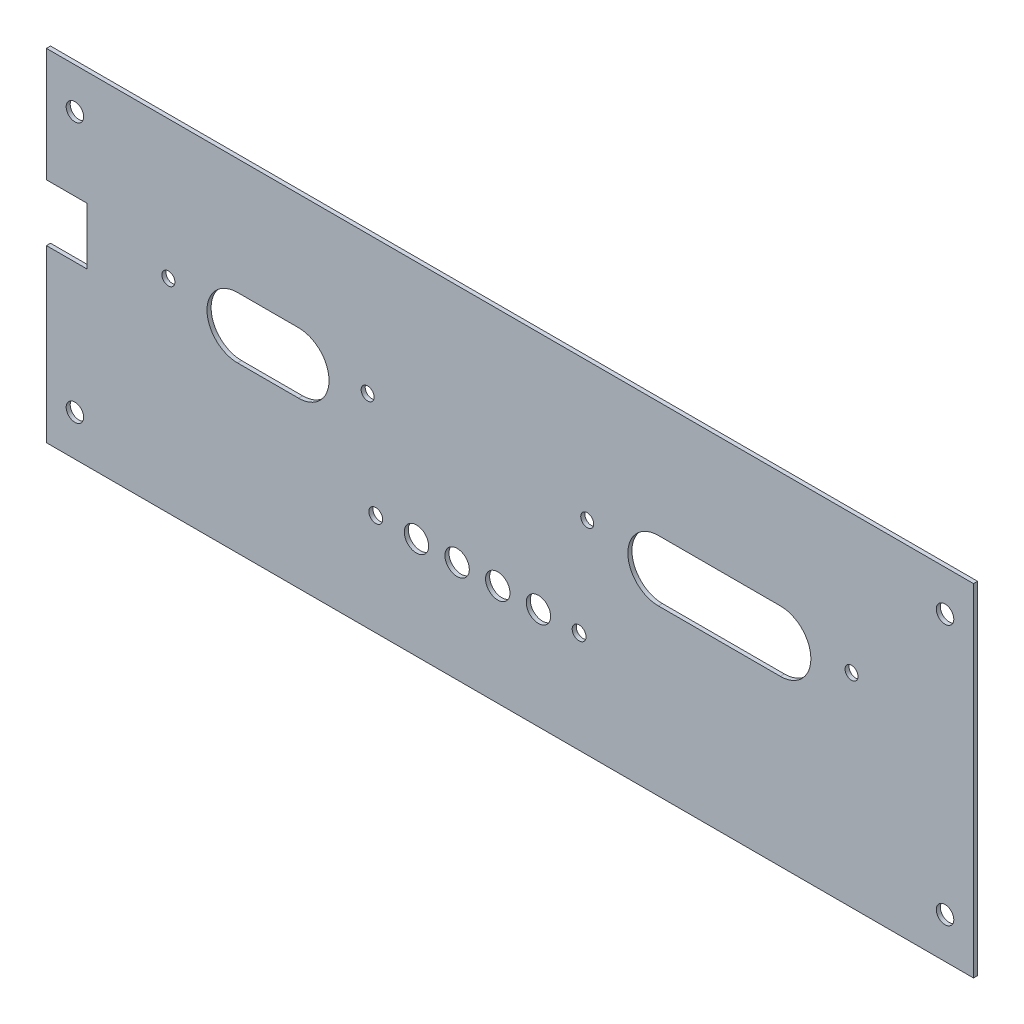
ISO-10303-21;
HEADER;
FILE_DESCRIPTION(('STEP AP214'),'2;1');
FILE_NAME('part.step','',(''),(''),'','','');
FILE_SCHEMA(('AUTOMOTIVE_DESIGN { 1 0 10303 214 1 1 1 1 }'));
ENDSEC;
DATA;
#1=APPLICATION_CONTEXT('core data for automotive mechanical design processes');
#2=APPLICATION_PROTOCOL_DEFINITION('international standard','automotive_design',2000,#1);
#3=PRODUCT_CONTEXT('',#1,'mechanical');
#4=PRODUCT('Part','Part','',(#3));
#5=PRODUCT_RELATED_PRODUCT_CATEGORY('part','',(#4));
#6=PRODUCT_DEFINITION_FORMATION('','',#4);
#7=PRODUCT_DEFINITION_CONTEXT('part definition',#1,'design');
#8=PRODUCT_DEFINITION('design','',#6,#7);
#9=PRODUCT_DEFINITION_SHAPE('','',#8);
#10=(LENGTH_UNIT() NAMED_UNIT(*) SI_UNIT(.MILLI.,.METRE.));
#11=(NAMED_UNIT(*) PLANE_ANGLE_UNIT() SI_UNIT($,.RADIAN.));
#12=(NAMED_UNIT(*) SI_UNIT($,.STERADIAN.) SOLID_ANGLE_UNIT());
#13=UNCERTAINTY_MEASURE_WITH_UNIT(LENGTH_MEASURE(1.E-05),#10,'distance_accuracy_value','');
#14=(GEOMETRIC_REPRESENTATION_CONTEXT(3) GLOBAL_UNCERTAINTY_ASSIGNED_CONTEXT((#13)) GLOBAL_UNIT_ASSIGNED_CONTEXT((#10,
#11,#12)) REPRESENTATION_CONTEXT('',''));
#15=CARTESIAN_POINT('',(0.,0.,0.));
#16=DIRECTION('',(0.,0.,1.));
#17=DIRECTION('',(1.,0.,0.));
#18=AXIS2_PLACEMENT_3D('',#15,#16,#17);
#19=CARTESIAN_POINT('',(-114.,-42.,1.));
#20=DIRECTION('',(1.,0.,0.));
#21=DIRECTION('',(0.,0.,-1.));
#22=AXIS2_PLACEMENT_3D('',#19,#20,#21);
#23=PLANE('',#22);
#24=DIRECTION('',(0.,-1.,0.));
#25=VECTOR('',#24,1.);
#26=CARTESIAN_POINT('',(-114.,-42.,0.));
#27=LINE('',#26,#25);
#28=CARTESIAN_POINT('',(-114.,42.,0.));
#29=VERTEX_POINT('',#28);
#30=CARTESIAN_POINT('',(-114.,14.,0.));
#31=VERTEX_POINT('',#30);
#32=EDGE_CURVE('E293',#29,#31,#27,.T.);
#33=ORIENTED_EDGE('',*,*,#32,.T.);
#34=DIRECTION('',(0.,0.,1.));
#35=VECTOR('',#34,1.);
#36=CARTESIAN_POINT('',(-114.,14.,1.));
#37=LINE('',#36,#35);
#38=CARTESIAN_POINT('',(-114.,14.,1.));
#39=VERTEX_POINT('',#38);
#40=EDGE_CURVE('E11',#31,#39,#37,.T.);
#41=ORIENTED_EDGE('',*,*,#40,.T.);
#42=DIRECTION('',(0.,-1.,0.));
#43=VECTOR('',#42,1.);
#44=CARTESIAN_POINT('',(-114.,-42.,1.));
#45=LINE('',#44,#43);
#46=CARTESIAN_POINT('',(-114.,42.,1.));
#47=VERTEX_POINT('',#46);
#48=EDGE_CURVE('E282',#47,#39,#45,.T.);
#49=ORIENTED_EDGE('',*,*,#48,.F.);
#50=DIRECTION('',(0.,0.,-1.));
#51=VECTOR('',#50,1.);
#52=CARTESIAN_POINT('',(-114.,42.,1.));
#53=LINE('',#52,#51);
#54=EDGE_CURVE('E292',#47,#29,#53,.T.);
#55=ORIENTED_EDGE('',*,*,#54,.T.);
#56=EDGE_LOOP('',(#33,#41,#49,#55));
#57=FACE_BOUND('',#56,.T.);
#58=ADVANCED_FACE('F31',(#57),#23,.F.);
#59=CARTESIAN_POINT('',(-114.,-42.,1.));
#60=DIRECTION('',(0.,0.,-1.));
#61=DIRECTION('',(-1.,0.,0.));
#62=AXIS2_PLACEMENT_3D('',#59,#60,#61);
#63=PLANE('',#62);
#64=CARTESIAN_POINT('',(-23.,-17.,1.));
#65=DIRECTION('',(0.,0.,1.));
#66=DIRECTION('',(1.,0.,0.));
#67=AXIS2_PLACEMENT_3D('',#64,#65,#66);
#68=CIRCLE('',#67,3.);
#69=CARTESIAN_POINT('',(-20.,-17.,1.));
#70=VERTEX_POINT('',#69);
#71=EDGE_CURVE('E342',#70,#70,#68,.T.);
#72=ORIENTED_EDGE('',*,*,#71,.F.);
#73=EDGE_LOOP('',(#72));
#74=FACE_BOUND('',#73,.T.);
#75=CARTESIAN_POINT('',(-13.,-17.,1.));
#76=DIRECTION('',(0.,0.,1.));
#77=DIRECTION('',(1.,0.,0.));
#78=AXIS2_PLACEMENT_3D('',#75,#76,#77);
#79=CIRCLE('',#78,3.);
#80=CARTESIAN_POINT('',(-10.,-17.,1.));
#81=VERTEX_POINT('',#80);
#82=EDGE_CURVE('E332',#81,#81,#79,.T.);
#83=ORIENTED_EDGE('',*,*,#82,.F.);
#84=EDGE_LOOP('',(#83));
#85=FACE_BOUND('',#84,.T.);
#86=CARTESIAN_POINT('',(-3.00000000000001,-17.,1.));
#87=DIRECTION('',(0.,0.,1.));
#88=DIRECTION('',(1.,0.,0.));
#89=AXIS2_PLACEMENT_3D('',#86,#87,#88);
#90=CIRCLE('',#89,3.);
#91=CARTESIAN_POINT('',(0.,-17.,1.));
#92=VERTEX_POINT('',#91);
#93=EDGE_CURVE('E329',#92,#92,#90,.T.);
#94=ORIENTED_EDGE('',*,*,#93,.F.);
#95=EDGE_LOOP('',(#94));
#96=FACE_BOUND('',#95,.T.);
#97=CARTESIAN_POINT('',(6.99999999999999,-17.,1.));
#98=DIRECTION('',(0.,0.,1.));
#99=DIRECTION('',(1.,0.,0.));
#100=AXIS2_PLACEMENT_3D('',#97,#98,#99);
#101=CIRCLE('',#100,3.);
#102=CARTESIAN_POINT('',(9.99999999999999,-17.,1.));
#103=VERTEX_POINT('',#102);
#104=EDGE_CURVE('E326',#103,#103,#101,.T.);
#105=ORIENTED_EDGE('',*,*,#104,.F.);
#106=EDGE_LOOP('',(#105));
#107=FACE_BOUND('',#106,.T.);
#108=CARTESIAN_POINT('',(17.,-17.,1.));
#109=DIRECTION('',(0.,0.,1.));
#110=DIRECTION('',(1.,0.,0.));
#111=AXIS2_PLACEMENT_3D('',#108,#109,#110);
#112=CIRCLE('',#111,1.7);
#113=CARTESIAN_POINT('',(18.7,-17.,1.));
#114=VERTEX_POINT('',#113);
#115=EDGE_CURVE('E322',#114,#114,#112,.T.);
#116=ORIENTED_EDGE('',*,*,#115,.F.);
#117=EDGE_LOOP('',(#116));
#118=FACE_BOUND('',#117,.T.);
#119=CARTESIAN_POINT('',(-33.,-17.,1.));
#120=DIRECTION('',(0.,0.,1.));
#121=DIRECTION('',(1.,0.,0.));
#122=AXIS2_PLACEMENT_3D('',#119,#120,#121);
#123=CIRCLE('',#122,1.7);
#124=CARTESIAN_POINT('',(-31.3,-17.,1.));
#125=VERTEX_POINT('',#124);
#126=EDGE_CURVE('E318',#125,#125,#123,.T.);
#127=ORIENTED_EDGE('',*,*,#126,.F.);
#128=EDGE_LOOP('',(#127));
#129=FACE_BOUND('',#128,.T.);
#130=CARTESIAN_POINT('',(-35.,8.00000000000001,1.));
#131=DIRECTION('',(0.,0.,1.));
#132=DIRECTION('',(1.,0.,0.));
#133=AXIS2_PLACEMENT_3D('',#130,#131,#132);
#134=CIRCLE('',#133,1.6);
#135=CARTESIAN_POINT('',(-33.4,8.00000000000001,1.));
#136=VERTEX_POINT('',#135);
#137=EDGE_CURVE('E170',#136,#136,#134,.T.);
#138=ORIENTED_EDGE('',*,*,#137,.F.);
#139=EDGE_LOOP('',(#138));
#140=FACE_BOUND('',#139,.T.);
#141=DIRECTION('',(1.,0.,0.));
#142=VECTOR('',#141,1.);
#143=CARTESIAN_POINT('',(-67.,-1.5,1.));
#144=LINE('',#143,#142);
#145=CARTESIAN_POINT('',(-67.,-1.5,1.));
#146=VERTEX_POINT('',#145);
#147=CARTESIAN_POINT('',(-52.,-1.5,1.));
#148=VERTEX_POINT('',#147);
#149=EDGE_CURVE('E176',#146,#148,#144,.T.);
#150=ORIENTED_EDGE('',*,*,#149,.F.);
#151=CARTESIAN_POINT('',(-67.,6.,1.));
#152=DIRECTION('',(0.,0.,1.));
#153=DIRECTION('',(1.,0.,0.));
#154=AXIS2_PLACEMENT_3D('',#151,#152,#153);
#155=CIRCLE('',#154,7.5);
#156=CARTESIAN_POINT('',(-67.,13.5,1.));
#157=VERTEX_POINT('',#156);
#158=EDGE_CURVE('E48',#157,#146,#155,.T.);
#159=ORIENTED_EDGE('',*,*,#158,.F.);
#160=DIRECTION('',(-1.,0.,0.));
#161=VECTOR('',#160,1.);
#162=CARTESIAN_POINT('',(-67.,13.5,1.));
#163=LINE('',#162,#161);
#164=CARTESIAN_POINT('',(-52.,13.5,1.));
#165=VERTEX_POINT('',#164);
#166=EDGE_CURVE('E164',#165,#157,#163,.T.);
#167=ORIENTED_EDGE('',*,*,#166,.F.);
#168=CARTESIAN_POINT('',(-52.,6.,1.));
#169=DIRECTION('',(0.,0.,1.));
#170=DIRECTION('',(-1.,0.,0.));
#171=AXIS2_PLACEMENT_3D('',#168,#169,#170);
#172=CIRCLE('',#171,7.5);
#173=EDGE_CURVE('E167',#148,#165,#172,.T.);
#174=ORIENTED_EDGE('',*,*,#173,.F.);
#175=EDGE_LOOP('',(#150,#159,#167,#174));
#176=FACE_BOUND('',#175,.T.);
#177=CARTESIAN_POINT('',(-84.,8.00000000000001,1.));
#178=DIRECTION('',(0.,0.,1.));
#179=DIRECTION('',(1.,0.,0.));
#180=AXIS2_PLACEMENT_3D('',#177,#178,#179);
#181=CIRCLE('',#180,1.6);
#182=CARTESIAN_POINT('',(-82.4,8.00000000000001,1.));
#183=VERTEX_POINT('',#182);
#184=EDGE_CURVE('E183',#183,#183,#181,.T.);
#185=ORIENTED_EDGE('',*,*,#184,.F.);
#186=EDGE_LOOP('',(#185));
#187=FACE_BOUND('',#186,.T.);
#188=CARTESIAN_POINT('',(84.,8.00000000000001,1.));
#189=DIRECTION('',(0.,0.,1.));
#190=DIRECTION('',(1.,0.,0.));
#191=AXIS2_PLACEMENT_3D('',#188,#189,#190);
#192=CIRCLE('',#191,1.6);
#193=CARTESIAN_POINT('',(85.6,8.00000000000001,1.));
#194=VERTEX_POINT('',#193);
#195=EDGE_CURVE('E190',#194,#194,#192,.T.);
#196=ORIENTED_EDGE('',*,*,#195,.F.);
#197=EDGE_LOOP('',(#196));
#198=FACE_BOUND('',#197,.T.);
#199=DIRECTION('',(1.,0.,0.));
#200=VECTOR('',#199,1.);
#201=CARTESIAN_POINT('',(36.5,-1.5,1.));
#202=LINE('',#201,#200);
#203=CARTESIAN_POINT('',(36.5,-1.5,1.));
#204=VERTEX_POINT('',#203);
#205=CARTESIAN_POINT('',(66.5,-1.5,1.));
#206=VERTEX_POINT('',#205);
#207=EDGE_CURVE('E214',#204,#206,#202,.T.);
#208=ORIENTED_EDGE('',*,*,#207,.F.);
#209=CARTESIAN_POINT('',(36.5,6.,1.));
#210=DIRECTION('',(0.,0.,1.));
#211=DIRECTION('',(1.,0.,0.));
#212=AXIS2_PLACEMENT_3D('',#209,#210,#211);
#213=CIRCLE('',#212,7.5);
#214=CARTESIAN_POINT('',(36.5,13.5,1.));
#215=VERTEX_POINT('',#214);
#216=EDGE_CURVE('E196',#215,#204,#213,.T.);
#217=ORIENTED_EDGE('',*,*,#216,.F.);
#218=DIRECTION('',(-1.,0.,0.));
#219=VECTOR('',#218,1.);
#220=CARTESIAN_POINT('',(36.5,13.5,1.));
#221=LINE('',#220,#219);
#222=CARTESIAN_POINT('',(66.5,13.5,1.));
#223=VERTEX_POINT('',#222);
#224=EDGE_CURVE('E203',#223,#215,#221,.T.);
#225=ORIENTED_EDGE('',*,*,#224,.F.);
#226=CARTESIAN_POINT('',(66.5,6.,1.));
#227=DIRECTION('',(0.,0.,1.));
#228=DIRECTION('',(-1.,0.,0.));
#229=AXIS2_PLACEMENT_3D('',#226,#227,#228);
#230=CIRCLE('',#229,7.5);
#231=EDGE_CURVE('E217',#206,#223,#230,.T.);
#232=ORIENTED_EDGE('',*,*,#231,.F.);
#233=EDGE_LOOP('',(#208,#217,#225,#232));
#234=FACE_BOUND('',#233,.T.);
#235=CARTESIAN_POINT('',(19.,8.00000000000001,1.));
#236=DIRECTION('',(0.,0.,1.));
#237=DIRECTION('',(1.,0.,0.));
#238=AXIS2_PLACEMENT_3D('',#235,#236,#237);
#239=CIRCLE('',#238,1.6);
#240=CARTESIAN_POINT('',(20.6,8.00000000000001,1.));
#241=VERTEX_POINT('',#240);
#242=EDGE_CURVE('E224',#241,#241,#239,.T.);
#243=ORIENTED_EDGE('',*,*,#242,.F.);
#244=EDGE_LOOP('',(#243));
#245=FACE_BOUND('',#244,.T.);
#246=CARTESIAN_POINT('',(-107.,-32.,1.));
#247=DIRECTION('',(0.,0.,1.));
#248=DIRECTION('',(1.,0.,0.));
#249=AXIS2_PLACEMENT_3D('',#246,#247,#248);
#250=CIRCLE('',#249,2.15);
#251=CARTESIAN_POINT('',(-104.85,-32.,1.));
#252=VERTEX_POINT('',#251);
#253=EDGE_CURVE('E264',#252,#252,#250,.T.);
#254=ORIENTED_EDGE('',*,*,#253,.F.);
#255=EDGE_LOOP('',(#254));
#256=FACE_BOUND('',#255,.T.);
#257=CARTESIAN_POINT('',(107.,32.,1.));
#258=DIRECTION('',(0.,0.,1.));
#259=DIRECTION('',(1.,0.,0.));
#260=AXIS2_PLACEMENT_3D('',#257,#258,#259);
#261=CIRCLE('',#260,2.15);
#262=CARTESIAN_POINT('',(109.15,32.,1.));
#263=VERTEX_POINT('',#262);
#264=EDGE_CURVE('E276',#263,#263,#261,.T.);
#265=ORIENTED_EDGE('',*,*,#264,.F.);
#266=EDGE_LOOP('',(#265));
#267=FACE_BOUND('',#266,.T.);
#268=ORIENTED_EDGE('',*,*,#48,.T.);
#269=DIRECTION('',(-1.,0.,0.));
#270=VECTOR('',#269,1.);
#271=CARTESIAN_POINT('',(-118.464145401672,14.,1.));
#272=LINE('',#271,#270);
#273=CARTESIAN_POINT('',(-104.,14.,1.));
#274=VERTEX_POINT('',#273);
#275=EDGE_CURVE('E241',#274,#39,#272,.T.);
#276=ORIENTED_EDGE('',*,*,#275,.F.);
#277=DIRECTION('',(0.,1.,0.));
#278=VECTOR('',#277,1.);
#279=CARTESIAN_POINT('',(-104.,0.,1.));
#280=LINE('',#279,#278);
#281=CARTESIAN_POINT('',(-104.,0.,1.));
#282=VERTEX_POINT('',#281);
#283=EDGE_CURVE('E249',#282,#274,#280,.T.);
#284=ORIENTED_EDGE('',*,*,#283,.F.);
#285=DIRECTION('',(1.,0.,0.));
#286=VECTOR('',#285,1.);
#287=CARTESIAN_POINT('',(-118.464145401672,0.,1.));
#288=LINE('',#287,#286);
#289=CARTESIAN_POINT('',(-114.,0.,1.));
#290=VERTEX_POINT('',#289);
#291=EDGE_CURVE('E234',#290,#282,#288,.T.);
#292=ORIENTED_EDGE('',*,*,#291,.F.);
#293=CARTESIAN_POINT('',(-114.,-42.,1.));
#294=VERTEX_POINT('',#293);
#295=EDGE_CURVE('E286',#290,#294,#45,.T.);
#296=ORIENTED_EDGE('',*,*,#295,.T.);
#297=DIRECTION('',(1.,0.,0.));
#298=VECTOR('',#297,1.);
#299=CARTESIAN_POINT('',(-114.,-42.,1.));
#300=LINE('',#299,#298);
#301=CARTESIAN_POINT('',(114.,-42.,1.));
#302=VERTEX_POINT('',#301);
#303=EDGE_CURVE('E285',#294,#302,#300,.T.);
#304=ORIENTED_EDGE('',*,*,#303,.T.);
#305=DIRECTION('',(0.,1.,0.));
#306=VECTOR('',#305,1.);
#307=CARTESIAN_POINT('',(114.,-42.,1.));
#308=LINE('',#307,#306);
#309=CARTESIAN_POINT('',(114.,42.,1.));
#310=VERTEX_POINT('',#309);
#311=EDGE_CURVE('E288',#302,#310,#308,.T.);
#312=ORIENTED_EDGE('',*,*,#311,.T.);
#313=DIRECTION('',(-1.,0.,0.));
#314=VECTOR('',#313,1.);
#315=CARTESIAN_POINT('',(-114.,42.,1.));
#316=LINE('',#315,#314);
#317=EDGE_CURVE('E290',#310,#47,#316,.T.);
#318=ORIENTED_EDGE('',*,*,#317,.T.);
#319=EDGE_LOOP('',(#268,#276,#284,#292,#296,#304,#312,#318));
#320=FACE_BOUND('',#319,.T.);
#321=CARTESIAN_POINT('',(-107.,32.,1.));
#322=DIRECTION('',(0.,0.,1.));
#323=DIRECTION('',(-1.,0.,0.));
#324=AXIS2_PLACEMENT_3D('',#321,#322,#323);
#325=CIRCLE('',#324,2.15);
#326=CARTESIAN_POINT('',(-109.15,32.,1.));
#327=VERTEX_POINT('',#326);
#328=EDGE_CURVE('E270',#327,#327,#325,.T.);
#329=ORIENTED_EDGE('',*,*,#328,.F.);
#330=EDGE_LOOP('',(#329));
#331=FACE_BOUND('',#330,.T.);
#332=CARTESIAN_POINT('',(107.,-32.,1.));
#333=DIRECTION('',(0.,0.,1.));
#334=DIRECTION('',(-1.,0.,0.));
#335=AXIS2_PLACEMENT_3D('',#332,#333,#334);
#336=CIRCLE('',#335,2.15);
#337=CARTESIAN_POINT('',(104.85,-32.,1.));
#338=VERTEX_POINT('',#337);
#339=EDGE_CURVE('E258',#338,#338,#336,.T.);
#340=ORIENTED_EDGE('',*,*,#339,.F.);
#341=EDGE_LOOP('',(#340));
#342=FACE_BOUND('',#341,.T.);
#343=ADVANCED_FACE('F358',(#74,#85,#96,#107,#118,#129,#140,#176,#187,#198,#234,#245,#256,#267,
#320,#331,#342),#63,.F.);
#344=CARTESIAN_POINT('',(-114.,-42.,0.));
#345=DIRECTION('',(0.,0.,-1.));
#346=DIRECTION('',(-1.,0.,0.));
#347=AXIS2_PLACEMENT_3D('',#344,#345,#346);
#348=PLANE('',#347);
#349=CARTESIAN_POINT('',(-23.,-17.,0.));
#350=DIRECTION('',(0.,0.,-1.));
#351=DIRECTION('',(-1.,0.,0.));
#352=AXIS2_PLACEMENT_3D('',#349,#350,#351);
#353=CIRCLE('',#352,3.);
#354=CARTESIAN_POINT('',(-26.,-17.,0.));
#355=VERTEX_POINT('',#354);
#356=EDGE_CURVE('E35',#355,#355,#353,.T.);
#357=ORIENTED_EDGE('',*,*,#356,.F.);
#358=EDGE_LOOP('',(#357));
#359=FACE_BOUND('',#358,.T.);
#360=CARTESIAN_POINT('',(-13.,-17.,0.));
#361=DIRECTION('',(0.,0.,-1.));
#362=DIRECTION('',(-1.,0.,0.));
#363=AXIS2_PLACEMENT_3D('',#360,#361,#362);
#364=CIRCLE('',#363,3.);
#365=CARTESIAN_POINT('',(-16.,-17.,0.));
#366=VERTEX_POINT('',#365);
#367=EDGE_CURVE('E330',#366,#366,#364,.T.);
#368=ORIENTED_EDGE('',*,*,#367,.F.);
#369=EDGE_LOOP('',(#368));
#370=FACE_BOUND('',#369,.T.);
#371=CARTESIAN_POINT('',(-3.00000000000001,-17.,0.));
#372=DIRECTION('',(0.,0.,-1.));
#373=DIRECTION('',(-1.,0.,0.));
#374=AXIS2_PLACEMENT_3D('',#371,#372,#373);
#375=CIRCLE('',#374,3.);
#376=CARTESIAN_POINT('',(-6.00000000000001,-17.,0.));
#377=VERTEX_POINT('',#376);
#378=EDGE_CURVE('E327',#377,#377,#375,.T.);
#379=ORIENTED_EDGE('',*,*,#378,.F.);
#380=EDGE_LOOP('',(#379));
#381=FACE_BOUND('',#380,.T.);
#382=CARTESIAN_POINT('',(6.99999999999999,-17.,0.));
#383=DIRECTION('',(0.,0.,-1.));
#384=DIRECTION('',(-1.,0.,0.));
#385=AXIS2_PLACEMENT_3D('',#382,#383,#384);
#386=CIRCLE('',#385,3.);
#387=CARTESIAN_POINT('',(3.99999999999998,-17.,0.));
#388=VERTEX_POINT('',#387);
#389=EDGE_CURVE('E323',#388,#388,#386,.T.);
#390=ORIENTED_EDGE('',*,*,#389,.F.);
#391=EDGE_LOOP('',(#390));
#392=FACE_BOUND('',#391,.T.);
#393=CARTESIAN_POINT('',(17.,-17.,0.));
#394=DIRECTION('',(0.,0.,-1.));
#395=DIRECTION('',(-1.,0.,0.));
#396=AXIS2_PLACEMENT_3D('',#393,#394,#395);
#397=CIRCLE('',#396,1.7);
#398=CARTESIAN_POINT('',(15.3,-17.,0.));
#399=VERTEX_POINT('',#398);
#400=EDGE_CURVE('E319',#399,#399,#397,.T.);
#401=ORIENTED_EDGE('',*,*,#400,.F.);
#402=EDGE_LOOP('',(#401));
#403=FACE_BOUND('',#402,.T.);
#404=CARTESIAN_POINT('',(-33.,-17.,0.));
#405=DIRECTION('',(0.,0.,-1.));
#406=DIRECTION('',(-1.,0.,0.));
#407=AXIS2_PLACEMENT_3D('',#404,#405,#406);
#408=CIRCLE('',#407,1.7);
#409=CARTESIAN_POINT('',(-34.7,-17.,0.));
#410=VERTEX_POINT('',#409);
#411=EDGE_CURVE('E315',#410,#410,#408,.T.);
#412=ORIENTED_EDGE('',*,*,#411,.F.);
#413=EDGE_LOOP('',(#412));
#414=FACE_BOUND('',#413,.T.);
#415=CARTESIAN_POINT('',(-35.,8.00000000000001,0.));
#416=DIRECTION('',(0.,0.,1.));
#417=DIRECTION('',(1.,0.,0.));
#418=AXIS2_PLACEMENT_3D('',#415,#416,#417);
#419=CIRCLE('',#418,1.6);
#420=CARTESIAN_POINT('',(-33.4,8.00000000000001,0.));
#421=VERTEX_POINT('',#420);
#422=EDGE_CURVE('E177',#421,#421,#419,.T.);
#423=ORIENTED_EDGE('',*,*,#422,.T.);
#424=EDGE_LOOP('',(#423));
#425=FACE_BOUND('',#424,.T.);
#426=CARTESIAN_POINT('',(-67.,6.,0.));
#427=DIRECTION('',(0.,0.,1.));
#428=DIRECTION('',(1.,0.,0.));
#429=AXIS2_PLACEMENT_3D('',#426,#427,#428);
#430=CIRCLE('',#429,7.5);
#431=CARTESIAN_POINT('',(-67.,13.5,0.));
#432=VERTEX_POINT('',#431);
#433=CARTESIAN_POINT('',(-67.,-1.5,0.));
#434=VERTEX_POINT('',#433);
#435=EDGE_CURVE('E148',#432,#434,#430,.T.);
#436=ORIENTED_EDGE('',*,*,#435,.T.);
#437=DIRECTION('',(1.,0.,0.));
#438=VECTOR('',#437,1.);
#439=CARTESIAN_POINT('',(-67.,-1.5,0.));
#440=LINE('',#439,#438);
#441=CARTESIAN_POINT('',(-52.,-1.5,0.));
#442=VERTEX_POINT('',#441);
#443=EDGE_CURVE('E157',#434,#442,#440,.T.);
#444=ORIENTED_EDGE('',*,*,#443,.T.);
#445=CARTESIAN_POINT('',(-52.,6.,0.));
#446=DIRECTION('',(0.,0.,1.));
#447=DIRECTION('',(-1.,0.,0.));
#448=AXIS2_PLACEMENT_3D('',#445,#446,#447);
#449=CIRCLE('',#448,7.5);
#450=CARTESIAN_POINT('',(-52.,13.5,0.));
#451=VERTEX_POINT('',#450);
#452=EDGE_CURVE('E56',#442,#451,#449,.T.);
#453=ORIENTED_EDGE('',*,*,#452,.T.);
#454=DIRECTION('',(-1.,0.,0.));
#455=VECTOR('',#454,1.);
#456=CARTESIAN_POINT('',(-67.,13.5,0.));
#457=LINE('',#456,#455);
#458=EDGE_CURVE('E154',#451,#432,#457,.T.);
#459=ORIENTED_EDGE('',*,*,#458,.T.);
#460=EDGE_LOOP('',(#436,#444,#453,#459));
#461=FACE_BOUND('',#460,.T.);
#462=CARTESIAN_POINT('',(-84.,8.00000000000001,0.));
#463=DIRECTION('',(0.,0.,1.));
#464=DIRECTION('',(1.,0.,0.));
#465=AXIS2_PLACEMENT_3D('',#462,#463,#464);
#466=CIRCLE('',#465,1.6);
#467=CARTESIAN_POINT('',(-82.4,8.00000000000001,0.));
#468=VERTEX_POINT('',#467);
#469=EDGE_CURVE('E187',#468,#468,#466,.T.);
#470=ORIENTED_EDGE('',*,*,#469,.T.);
#471=EDGE_LOOP('',(#470));
#472=FACE_BOUND('',#471,.T.);
#473=CARTESIAN_POINT('',(84.,8.00000000000001,0.));
#474=DIRECTION('',(0.,0.,1.));
#475=DIRECTION('',(1.,0.,0.));
#476=AXIS2_PLACEMENT_3D('',#473,#474,#475);
#477=CIRCLE('',#476,1.6);
#478=CARTESIAN_POINT('',(85.6,8.00000000000001,0.));
#479=VERTEX_POINT('',#478);
#480=EDGE_CURVE('E193',#479,#479,#477,.T.);
#481=ORIENTED_EDGE('',*,*,#480,.T.);
#482=EDGE_LOOP('',(#481));
#483=FACE_BOUND('',#482,.T.);
#484=CARTESIAN_POINT('',(36.5,6.,0.));
#485=DIRECTION('',(0.,0.,1.));
#486=DIRECTION('',(1.,0.,0.));
#487=AXIS2_PLACEMENT_3D('',#484,#485,#486);
#488=CIRCLE('',#487,7.5);
#489=CARTESIAN_POINT('',(36.5,13.5,0.));
#490=VERTEX_POINT('',#489);
#491=CARTESIAN_POINT('',(36.5,-1.5,0.));
#492=VERTEX_POINT('',#491);
#493=EDGE_CURVE('E199',#490,#492,#488,.T.);
#494=ORIENTED_EDGE('',*,*,#493,.T.);
#495=DIRECTION('',(1.,0.,0.));
#496=VECTOR('',#495,1.);
#497=CARTESIAN_POINT('',(36.5,-1.5,0.));
#498=LINE('',#497,#496);
#499=CARTESIAN_POINT('',(66.5,-1.5,0.));
#500=VERTEX_POINT('',#499);
#501=EDGE_CURVE('E202',#492,#500,#498,.T.);
#502=ORIENTED_EDGE('',*,*,#501,.T.);
#503=CARTESIAN_POINT('',(66.5,6.,0.));
#504=DIRECTION('',(0.,0.,1.));
#505=DIRECTION('',(-1.,0.,0.));
#506=AXIS2_PLACEMENT_3D('',#503,#504,#505);
#507=CIRCLE('',#506,7.5);
#508=CARTESIAN_POINT('',(66.5,13.5,0.));
#509=VERTEX_POINT('',#508);
#510=EDGE_CURVE('E206',#500,#509,#507,.T.);
#511=ORIENTED_EDGE('',*,*,#510,.T.);
#512=DIRECTION('',(-1.,0.,0.));
#513=VECTOR('',#512,1.);
#514=CARTESIAN_POINT('',(36.5,13.5,0.));
#515=LINE('',#514,#513);
#516=EDGE_CURVE('E209',#509,#490,#515,.T.);
#517=ORIENTED_EDGE('',*,*,#516,.T.);
#518=EDGE_LOOP('',(#494,#502,#511,#517));
#519=FACE_BOUND('',#518,.T.);
#520=CARTESIAN_POINT('',(19.,8.00000000000001,0.));
#521=DIRECTION('',(0.,0.,1.));
#522=DIRECTION('',(1.,0.,0.));
#523=AXIS2_PLACEMENT_3D('',#520,#521,#522);
#524=CIRCLE('',#523,1.6);
#525=CARTESIAN_POINT('',(20.6,8.00000000000001,0.));
#526=VERTEX_POINT('',#525);
#527=EDGE_CURVE('E231',#526,#526,#524,.T.);
#528=ORIENTED_EDGE('',*,*,#527,.T.);
#529=EDGE_LOOP('',(#528));
#530=FACE_BOUND('',#529,.T.);
#531=DIRECTION('',(-1.,0.,0.));
#532=VECTOR('',#531,1.);
#533=CARTESIAN_POINT('',(-118.464145401672,14.,0.));
#534=LINE('',#533,#532);
#535=CARTESIAN_POINT('',(-104.,14.,0.));
#536=VERTEX_POINT('',#535);
#537=EDGE_CURVE('E244',#536,#31,#534,.T.);
#538=ORIENTED_EDGE('',*,*,#537,.T.);
#539=ORIENTED_EDGE('',*,*,#32,.F.);
#540=DIRECTION('',(-1.,0.,0.));
#541=VECTOR('',#540,1.);
#542=CARTESIAN_POINT('',(-114.,42.,0.));
#543=LINE('',#542,#541);
#544=CARTESIAN_POINT('',(114.,42.,0.));
#545=VERTEX_POINT('',#544);
#546=EDGE_CURVE('E300',#545,#29,#543,.T.);
#547=ORIENTED_EDGE('',*,*,#546,.F.);
#548=DIRECTION('',(0.,1.,0.));
#549=VECTOR('',#548,1.);
#550=CARTESIAN_POINT('',(114.,-42.,0.));
#551=LINE('',#550,#549);
#552=CARTESIAN_POINT('',(114.,-42.,0.));
#553=VERTEX_POINT('',#552);
#554=EDGE_CURVE('E298',#553,#545,#551,.T.);
#555=ORIENTED_EDGE('',*,*,#554,.F.);
#556=DIRECTION('',(1.,0.,0.));
#557=VECTOR('',#556,1.);
#558=CARTESIAN_POINT('',(-114.,-42.,0.));
#559=LINE('',#558,#557);
#560=CARTESIAN_POINT('',(-114.,-42.,0.));
#561=VERTEX_POINT('',#560);
#562=EDGE_CURVE('E296',#561,#553,#559,.T.);
#563=ORIENTED_EDGE('',*,*,#562,.F.);
#564=CARTESIAN_POINT('',(-114.,0.,0.));
#565=VERTEX_POINT('',#564);
#566=EDGE_CURVE('E279',#565,#561,#27,.T.);
#567=ORIENTED_EDGE('',*,*,#566,.F.);
#568=DIRECTION('',(1.,0.,0.));
#569=VECTOR('',#568,1.);
#570=CARTESIAN_POINT('',(-118.464145401672,0.,0.));
#571=LINE('',#570,#569);
#572=CARTESIAN_POINT('',(-104.,0.,0.));
#573=VERTEX_POINT('',#572);
#574=EDGE_CURVE('E237',#565,#573,#571,.T.);
#575=ORIENTED_EDGE('',*,*,#574,.T.);
#576=DIRECTION('',(0.,1.,0.));
#577=VECTOR('',#576,1.);
#578=CARTESIAN_POINT('',(-104.,0.,0.));
#579=LINE('',#578,#577);
#580=EDGE_CURVE('E240',#573,#536,#579,.T.);
#581=ORIENTED_EDGE('',*,*,#580,.T.);
#582=EDGE_LOOP('',(#538,#539,#547,#555,#563,#567,#575,#581));
#583=FACE_BOUND('',#582,.T.);
#584=CARTESIAN_POINT('',(-107.,-32.,0.));
#585=DIRECTION('',(0.,0.,1.));
#586=DIRECTION('',(1.,0.,0.));
#587=AXIS2_PLACEMENT_3D('',#584,#585,#586);
#588=CIRCLE('',#587,2.15);
#589=CARTESIAN_POINT('',(-104.85,-32.,0.));
#590=VERTEX_POINT('',#589);
#591=EDGE_CURVE('E261',#590,#590,#588,.T.);
#592=ORIENTED_EDGE('',*,*,#591,.T.);
#593=EDGE_LOOP('',(#592));
#594=FACE_BOUND('',#593,.T.);
#595=CARTESIAN_POINT('',(107.,32.,0.));
#596=DIRECTION('',(0.,0.,1.));
#597=DIRECTION('',(1.,0.,0.));
#598=AXIS2_PLACEMENT_3D('',#595,#596,#597);
#599=CIRCLE('',#598,2.15);
#600=CARTESIAN_POINT('',(109.15,32.,0.));
#601=VERTEX_POINT('',#600);
#602=EDGE_CURVE('E273',#601,#601,#599,.T.);
#603=ORIENTED_EDGE('',*,*,#602,.T.);
#604=EDGE_LOOP('',(#603));
#605=FACE_BOUND('',#604,.T.);
#606=CARTESIAN_POINT('',(-107.,32.,0.));
#607=DIRECTION('',(0.,0.,1.));
#608=DIRECTION('',(-1.,0.,0.));
#609=AXIS2_PLACEMENT_3D('',#606,#607,#608);
#610=CIRCLE('',#609,2.15);
#611=CARTESIAN_POINT('',(-109.15,32.,0.));
#612=VERTEX_POINT('',#611);
#613=EDGE_CURVE('E267',#612,#612,#610,.T.);
#614=ORIENTED_EDGE('',*,*,#613,.T.);
#615=EDGE_LOOP('',(#614));
#616=FACE_BOUND('',#615,.T.);
#617=CARTESIAN_POINT('',(107.,-32.,0.));
#618=DIRECTION('',(0.,0.,1.));
#619=DIRECTION('',(-1.,0.,0.));
#620=AXIS2_PLACEMENT_3D('',#617,#618,#619);
#621=CIRCLE('',#620,2.15);
#622=CARTESIAN_POINT('',(104.85,-32.,0.));
#623=VERTEX_POINT('',#622);
#624=EDGE_CURVE('E255',#623,#623,#621,.T.);
#625=ORIENTED_EDGE('',*,*,#624,.T.);
#626=EDGE_LOOP('',(#625));
#627=FACE_BOUND('',#626,.T.);
#628=ADVANCED_FACE('F161',(#359,#370,#381,#392,#403,#414,#425,#461,#472,#483,#519,#530,#583,
#594,#605,#616,#627),#348,.T.);
#629=ORIENTED_EDGE('',*,*,#295,.F.);
#630=DIRECTION('',(0.,0.,-1.));
#631=VECTOR('',#630,1.);
#632=CARTESIAN_POINT('',(-114.,0.,1.));
#633=LINE('',#632,#631);
#634=EDGE_CURVE('E40',#290,#565,#633,.T.);
#635=ORIENTED_EDGE('',*,*,#634,.T.);
#636=ORIENTED_EDGE('',*,*,#566,.T.);
#637=DIRECTION('',(0.,0.,-1.));
#638=VECTOR('',#637,1.);
#639=CARTESIAN_POINT('',(-114.,-42.,1.));
#640=LINE('',#639,#638);
#641=EDGE_CURVE('E310',#294,#561,#640,.T.);
#642=ORIENTED_EDGE('',*,*,#641,.F.);
#643=EDGE_LOOP('',(#629,#635,#636,#642));
#644=FACE_BOUND('',#643,.T.);
#645=ADVANCED_FACE('F33',(#644),#23,.F.);
#646=CARTESIAN_POINT('',(-114.,-42.,1.));
#647=DIRECTION('',(0.,1.,0.));
#648=DIRECTION('',(0.,0.,1.));
#649=AXIS2_PLACEMENT_3D('',#646,#647,#648);
#650=PLANE('',#649);
#651=ORIENTED_EDGE('',*,*,#562,.T.);
#652=DIRECTION('',(0.,0.,-1.));
#653=VECTOR('',#652,1.);
#654=CARTESIAN_POINT('',(114.,-42.,1.));
#655=LINE('',#654,#653);
#656=EDGE_CURVE('E307',#302,#553,#655,.T.);
#657=ORIENTED_EDGE('',*,*,#656,.F.);
#658=ORIENTED_EDGE('',*,*,#303,.F.);
#659=ORIENTED_EDGE('',*,*,#641,.T.);
#660=EDGE_LOOP('',(#651,#657,#658,#659));
#661=FACE_BOUND('',#660,.T.);
#662=ADVANCED_FACE('F400',(#661),#650,.F.);
#663=CARTESIAN_POINT('',(114.,-42.,1.));
#664=DIRECTION('',(-1.,0.,0.));
#665=DIRECTION('',(0.,0.,1.));
#666=AXIS2_PLACEMENT_3D('',#663,#664,#665);
#667=PLANE('',#666);
#668=ORIENTED_EDGE('',*,*,#554,.T.);
#669=DIRECTION('',(0.,0.,-1.));
#670=VECTOR('',#669,1.);
#671=CARTESIAN_POINT('',(114.,42.,1.));
#672=LINE('',#671,#670);
#673=EDGE_CURVE('E304',#310,#545,#672,.T.);
#674=ORIENTED_EDGE('',*,*,#673,.F.);
#675=ORIENTED_EDGE('',*,*,#311,.F.);
#676=ORIENTED_EDGE('',*,*,#656,.T.);
#677=EDGE_LOOP('',(#668,#674,#675,#676));
#678=FACE_BOUND('',#677,.T.);
#679=ADVANCED_FACE('F435',(#678),#667,.F.);
#680=CARTESIAN_POINT('',(-114.,42.,1.));
#681=DIRECTION('',(0.,-1.,0.));
#682=DIRECTION('',(1.,0.,0.));
#683=AXIS2_PLACEMENT_3D('',#680,#681,#682);
#684=PLANE('',#683);
#685=ORIENTED_EDGE('',*,*,#546,.T.);
#686=ORIENTED_EDGE('',*,*,#54,.F.);
#687=ORIENTED_EDGE('',*,*,#317,.F.);
#688=ORIENTED_EDGE('',*,*,#673,.T.);
#689=EDGE_LOOP('',(#685,#686,#687,#688));
#690=FACE_BOUND('',#689,.T.);
#691=ADVANCED_FACE('F437',(#690),#684,.F.);
#692=CARTESIAN_POINT('',(107.,32.,1.));
#693=DIRECTION('',(0.,0.,-1.));
#694=DIRECTION('',(-1.,0.,0.));
#695=AXIS2_PLACEMENT_3D('',#692,#693,#694);
#696=CYLINDRICAL_SURFACE('',#695,2.15);
#697=ORIENTED_EDGE('',*,*,#264,.T.);
#698=EDGE_LOOP('',(#697));
#699=FACE_BOUND('',#698,.T.);
#700=ORIENTED_EDGE('',*,*,#602,.F.);
#701=EDGE_LOOP('',(#700));
#702=FACE_BOUND('',#701,.T.);
#703=ADVANCED_FACE('F439',(#699,#702),#696,.F.);
#704=CARTESIAN_POINT('',(-107.,32.,1.));
#705=DIRECTION('',(0.,0.,-1.));
#706=DIRECTION('',(-1.,0.,0.));
#707=AXIS2_PLACEMENT_3D('',#704,#705,#706);
#708=CYLINDRICAL_SURFACE('',#707,2.15);
#709=ORIENTED_EDGE('',*,*,#328,.T.);
#710=EDGE_LOOP('',(#709));
#711=FACE_BOUND('',#710,.T.);
#712=ORIENTED_EDGE('',*,*,#613,.F.);
#713=EDGE_LOOP('',(#712));
#714=FACE_BOUND('',#713,.T.);
#715=ADVANCED_FACE('F444',(#711,#714),#708,.F.);
#716=CARTESIAN_POINT('',(-107.,-32.,1.));
#717=DIRECTION('',(0.,0.,-1.));
#718=DIRECTION('',(-1.,0.,0.));
#719=AXIS2_PLACEMENT_3D('',#716,#717,#718);
#720=CYLINDRICAL_SURFACE('',#719,2.15);
#721=ORIENTED_EDGE('',*,*,#253,.T.);
#722=EDGE_LOOP('',(#721));
#723=FACE_BOUND('',#722,.T.);
#724=ORIENTED_EDGE('',*,*,#591,.F.);
#725=EDGE_LOOP('',(#724));
#726=FACE_BOUND('',#725,.T.);
#727=ADVANCED_FACE('F390',(#723,#726),#720,.F.);
#728=CARTESIAN_POINT('',(107.,-32.,1.));
#729=DIRECTION('',(0.,0.,-1.));
#730=DIRECTION('',(-1.,0.,0.));
#731=AXIS2_PLACEMENT_3D('',#728,#729,#730);
#732=CYLINDRICAL_SURFACE('',#731,2.15);
#733=ORIENTED_EDGE('',*,*,#339,.T.);
#734=EDGE_LOOP('',(#733));
#735=FACE_BOUND('',#734,.T.);
#736=ORIENTED_EDGE('',*,*,#624,.F.);
#737=EDGE_LOOP('',(#736));
#738=FACE_BOUND('',#737,.T.);
#739=ADVANCED_FACE('F386',(#735,#738),#732,.F.);
#740=CARTESIAN_POINT('',(-118.464145401672,14.,0.));
#741=DIRECTION('',(0.,1.,0.));
#742=DIRECTION('',(0.,0.,1.));
#743=AXIS2_PLACEMENT_3D('',#740,#741,#742);
#744=PLANE('',#743);
#745=ORIENTED_EDGE('',*,*,#537,.F.);
#746=DIRECTION('',(0.,0.,1.));
#747=VECTOR('',#746,1.);
#748=CARTESIAN_POINT('',(-104.,14.,0.));
#749=LINE('',#748,#747);
#750=EDGE_CURVE('E253',#536,#274,#749,.T.);
#751=ORIENTED_EDGE('',*,*,#750,.T.);
#752=ORIENTED_EDGE('',*,*,#275,.T.);
#753=ORIENTED_EDGE('',*,*,#40,.F.);
#754=EDGE_LOOP('',(#745,#751,#752,#753));
#755=FACE_BOUND('',#754,.T.);
#756=ADVANCED_FACE('F389',(#755),#744,.F.);
#757=CARTESIAN_POINT('',(-118.464145401672,0.,0.));
#758=DIRECTION('',(0.,-1.,0.));
#759=DIRECTION('',(0.,0.,-1.));
#760=AXIS2_PLACEMENT_3D('',#757,#758,#759);
#761=PLANE('',#760);
#762=ORIENTED_EDGE('',*,*,#291,.T.);
#763=DIRECTION('',(0.,0.,1.));
#764=VECTOR('',#763,1.);
#765=CARTESIAN_POINT('',(-104.,0.,0.));
#766=LINE('',#765,#764);
#767=EDGE_CURVE('E247',#573,#282,#766,.T.);
#768=ORIENTED_EDGE('',*,*,#767,.F.);
#769=ORIENTED_EDGE('',*,*,#574,.F.);
#770=ORIENTED_EDGE('',*,*,#634,.F.);
#771=EDGE_LOOP('',(#762,#768,#769,#770));
#772=FACE_BOUND('',#771,.T.);
#773=ADVANCED_FACE('F424',(#772),#761,.F.);
#774=CARTESIAN_POINT('',(-104.,0.,0.));
#775=DIRECTION('',(1.,0.,0.));
#776=DIRECTION('',(0.,0.,-1.));
#777=AXIS2_PLACEMENT_3D('',#774,#775,#776);
#778=PLANE('',#777);
#779=ORIENTED_EDGE('',*,*,#283,.T.);
#780=ORIENTED_EDGE('',*,*,#750,.F.);
#781=ORIENTED_EDGE('',*,*,#580,.F.);
#782=ORIENTED_EDGE('',*,*,#767,.T.);
#783=EDGE_LOOP('',(#779,#780,#781,#782));
#784=FACE_BOUND('',#783,.T.);
#785=ADVANCED_FACE('F422',(#784),#778,.F.);
#786=CARTESIAN_POINT('',(19.,8.00000000000001,0.));
#787=DIRECTION('',(0.,0.,1.));
#788=DIRECTION('',(1.,0.,0.));
#789=AXIS2_PLACEMENT_3D('',#786,#787,#788);
#790=CYLINDRICAL_SURFACE('',#789,1.6);
#791=ORIENTED_EDGE('',*,*,#527,.F.);
#792=EDGE_LOOP('',(#791));
#793=FACE_BOUND('',#792,.T.);
#794=ORIENTED_EDGE('',*,*,#242,.T.);
#795=EDGE_LOOP('',(#794));
#796=FACE_BOUND('',#795,.T.);
#797=ADVANCED_FACE('F525',(#793,#796),#790,.F.);
#798=CARTESIAN_POINT('',(36.5,6.,0.));
#799=DIRECTION('',(0.,0.,1.));
#800=DIRECTION('',(1.,0.,0.));
#801=AXIS2_PLACEMENT_3D('',#798,#799,#800);
#802=CYLINDRICAL_SURFACE('',#801,7.5);
#803=ORIENTED_EDGE('',*,*,#216,.T.);
#804=DIRECTION('',(0.,0.,1.));
#805=VECTOR('',#804,1.);
#806=CARTESIAN_POINT('',(36.5,-1.5,0.));
#807=LINE('',#806,#805);
#808=EDGE_CURVE('E212',#492,#204,#807,.T.);
#809=ORIENTED_EDGE('',*,*,#808,.F.);
#810=ORIENTED_EDGE('',*,*,#493,.F.);
#811=DIRECTION('',(0.,0.,1.));
#812=VECTOR('',#811,1.);
#813=CARTESIAN_POINT('',(36.5,13.5,0.));
#814=LINE('',#813,#812);
#815=EDGE_CURVE('E222',#490,#215,#814,.T.);
#816=ORIENTED_EDGE('',*,*,#815,.T.);
#817=EDGE_LOOP('',(#803,#809,#810,#816));
#818=FACE_BOUND('',#817,.T.);
#819=ADVANCED_FACE('F534',(#818),#802,.F.);
#820=CARTESIAN_POINT('',(36.5,13.5,0.));
#821=DIRECTION('',(0.,1.,0.));
#822=DIRECTION('',(0.,0.,1.));
#823=AXIS2_PLACEMENT_3D('',#820,#821,#822);
#824=PLANE('',#823);
#825=ORIENTED_EDGE('',*,*,#224,.T.);
#826=ORIENTED_EDGE('',*,*,#815,.F.);
#827=ORIENTED_EDGE('',*,*,#516,.F.);
#828=DIRECTION('',(0.,0.,1.));
#829=VECTOR('',#828,1.);
#830=CARTESIAN_POINT('',(66.5,13.5,0.));
#831=LINE('',#830,#829);
#832=EDGE_CURVE('E225',#509,#223,#831,.T.);
#833=ORIENTED_EDGE('',*,*,#832,.T.);
#834=EDGE_LOOP('',(#825,#826,#827,#833));
#835=FACE_BOUND('',#834,.T.);
#836=ADVANCED_FACE('F544',(#835),#824,.F.);
#837=CARTESIAN_POINT('',(66.5,6.,0.));
#838=DIRECTION('',(0.,0.,1.));
#839=DIRECTION('',(1.,0.,0.));
#840=AXIS2_PLACEMENT_3D('',#837,#838,#839);
#841=CYLINDRICAL_SURFACE('',#840,7.5);
#842=ORIENTED_EDGE('',*,*,#231,.T.);
#843=ORIENTED_EDGE('',*,*,#832,.F.);
#844=ORIENTED_EDGE('',*,*,#510,.F.);
#845=DIRECTION('',(0.,0.,1.));
#846=VECTOR('',#845,1.);
#847=CARTESIAN_POINT('',(66.5,-1.5,0.));
#848=LINE('',#847,#846);
#849=EDGE_CURVE('E227',#500,#206,#848,.T.);
#850=ORIENTED_EDGE('',*,*,#849,.T.);
#851=EDGE_LOOP('',(#842,#843,#844,#850));
#852=FACE_BOUND('',#851,.T.);
#853=ADVANCED_FACE('F554',(#852),#841,.F.);
#854=CARTESIAN_POINT('',(36.5,-1.5,0.));
#855=DIRECTION('',(0.,-1.,0.));
#856=DIRECTION('',(0.,0.,-1.));
#857=AXIS2_PLACEMENT_3D('',#854,#855,#856);
#858=PLANE('',#857);
#859=ORIENTED_EDGE('',*,*,#207,.T.);
#860=ORIENTED_EDGE('',*,*,#849,.F.);
#861=ORIENTED_EDGE('',*,*,#501,.F.);
#862=ORIENTED_EDGE('',*,*,#808,.T.);
#863=EDGE_LOOP('',(#859,#860,#861,#862));
#864=FACE_BOUND('',#863,.T.);
#865=ADVANCED_FACE('F564',(#864),#858,.F.);
#866=CARTESIAN_POINT('',(84.,8.00000000000001,0.));
#867=DIRECTION('',(0.,0.,1.));
#868=DIRECTION('',(1.,0.,0.));
#869=AXIS2_PLACEMENT_3D('',#866,#867,#868);
#870=CYLINDRICAL_SURFACE('',#869,1.6);
#871=ORIENTED_EDGE('',*,*,#480,.F.);
#872=EDGE_LOOP('',(#871));
#873=FACE_BOUND('',#872,.T.);
#874=ORIENTED_EDGE('',*,*,#195,.T.);
#875=EDGE_LOOP('',(#874));
#876=FACE_BOUND('',#875,.T.);
#877=ADVANCED_FACE('F574',(#873,#876),#870,.F.);
#878=CARTESIAN_POINT('',(-84.,8.00000000000001,0.));
#879=DIRECTION('',(0.,0.,1.));
#880=DIRECTION('',(1.,0.,0.));
#881=AXIS2_PLACEMENT_3D('',#878,#879,#880);
#882=CYLINDRICAL_SURFACE('',#881,1.6);
#883=ORIENTED_EDGE('',*,*,#469,.F.);
#884=EDGE_LOOP('',(#883));
#885=FACE_BOUND('',#884,.T.);
#886=ORIENTED_EDGE('',*,*,#184,.T.);
#887=EDGE_LOOP('',(#886));
#888=FACE_BOUND('',#887,.T.);
#889=ADVANCED_FACE('F584',(#885,#888),#882,.F.);
#890=CARTESIAN_POINT('',(-67.,6.,0.));
#891=DIRECTION('',(0.,0.,1.));
#892=DIRECTION('',(1.,0.,0.));
#893=AXIS2_PLACEMENT_3D('',#890,#891,#892);
#894=CYLINDRICAL_SURFACE('',#893,7.5);
#895=ORIENTED_EDGE('',*,*,#158,.T.);
#896=DIRECTION('',(0.,0.,1.));
#897=VECTOR('',#896,1.);
#898=CARTESIAN_POINT('',(-67.,-1.5,0.));
#899=LINE('',#898,#897);
#900=EDGE_CURVE('E144',#434,#146,#899,.T.);
#901=ORIENTED_EDGE('',*,*,#900,.F.);
#902=ORIENTED_EDGE('',*,*,#435,.F.);
#903=DIRECTION('',(0.,0.,1.));
#904=VECTOR('',#903,1.);
#905=CARTESIAN_POINT('',(-67.,13.5,0.));
#906=LINE('',#905,#904);
#907=EDGE_CURVE('E181',#432,#157,#906,.T.);
#908=ORIENTED_EDGE('',*,*,#907,.T.);
#909=EDGE_LOOP('',(#895,#901,#902,#908));
#910=FACE_BOUND('',#909,.T.);
#911=ADVANCED_FACE('F146',(#910),#894,.F.);
#912=CARTESIAN_POINT('',(-67.,13.5,0.));
#913=DIRECTION('',(0.,1.,0.));
#914=DIRECTION('',(0.,0.,1.));
#915=AXIS2_PLACEMENT_3D('',#912,#913,#914);
#916=PLANE('',#915);
#917=ORIENTED_EDGE('',*,*,#166,.T.);
#918=ORIENTED_EDGE('',*,*,#907,.F.);
#919=ORIENTED_EDGE('',*,*,#458,.F.);
#920=DIRECTION('',(0.,0.,1.));
#921=VECTOR('',#920,1.);
#922=CARTESIAN_POINT('',(-52.,13.5,0.));
#923=LINE('',#922,#921);
#924=EDGE_CURVE('E184',#451,#165,#923,.T.);
#925=ORIENTED_EDGE('',*,*,#924,.T.);
#926=EDGE_LOOP('',(#917,#918,#919,#925));
#927=FACE_BOUND('',#926,.T.);
#928=ADVANCED_FACE('F603',(#927),#916,.F.);
#929=CARTESIAN_POINT('',(-52.,6.,0.));
#930=DIRECTION('',(0.,0.,1.));
#931=DIRECTION('',(1.,0.,0.));
#932=AXIS2_PLACEMENT_3D('',#929,#930,#931);
#933=CYLINDRICAL_SURFACE('',#932,7.5);
#934=ORIENTED_EDGE('',*,*,#173,.T.);
#935=ORIENTED_EDGE('',*,*,#924,.F.);
#936=ORIENTED_EDGE('',*,*,#452,.F.);
#937=DIRECTION('',(0.,0.,1.));
#938=VECTOR('',#937,1.);
#939=CARTESIAN_POINT('',(-52.,-1.5,0.));
#940=LINE('',#939,#938);
#941=EDGE_CURVE('E153',#442,#148,#940,.T.);
#942=ORIENTED_EDGE('',*,*,#941,.T.);
#943=EDGE_LOOP('',(#934,#935,#936,#942));
#944=FACE_BOUND('',#943,.T.);
#945=ADVANCED_FACE('F612',(#944),#933,.F.);
#946=CARTESIAN_POINT('',(-67.,-1.5,0.));
#947=DIRECTION('',(0.,-1.,0.));
#948=DIRECTION('',(0.,0.,-1.));
#949=AXIS2_PLACEMENT_3D('',#946,#947,#948);
#950=PLANE('',#949);
#951=ORIENTED_EDGE('',*,*,#149,.T.);
#952=ORIENTED_EDGE('',*,*,#941,.F.);
#953=ORIENTED_EDGE('',*,*,#443,.F.);
#954=ORIENTED_EDGE('',*,*,#900,.T.);
#955=EDGE_LOOP('',(#951,#952,#953,#954));
#956=FACE_BOUND('',#955,.T.);
#957=ADVANCED_FACE('F158',(#956),#950,.F.);
#958=CARTESIAN_POINT('',(-35.,8.00000000000001,0.));
#959=DIRECTION('',(0.,0.,1.));
#960=DIRECTION('',(1.,0.,0.));
#961=AXIS2_PLACEMENT_3D('',#958,#959,#960);
#962=CYLINDRICAL_SURFACE('',#961,1.6);
#963=ORIENTED_EDGE('',*,*,#422,.F.);
#964=EDGE_LOOP('',(#963));
#965=FACE_BOUND('',#964,.T.);
#966=ORIENTED_EDGE('',*,*,#137,.T.);
#967=EDGE_LOOP('',(#966));
#968=FACE_BOUND('',#967,.T.);
#969=ADVANCED_FACE('F356',(#965,#968),#962,.F.);
#970=CARTESIAN_POINT('',(-33.,-17.,-9.));
#971=DIRECTION('',(0.,0.,1.));
#972=DIRECTION('',(1.,0.,0.));
#973=AXIS2_PLACEMENT_3D('',#970,#971,#972);
#974=CYLINDRICAL_SURFACE('',#973,1.7);
#975=ORIENTED_EDGE('',*,*,#411,.T.);
#976=EDGE_LOOP('',(#975));
#977=FACE_BOUND('',#976,.T.);
#978=ORIENTED_EDGE('',*,*,#126,.T.);
#979=EDGE_LOOP('',(#978));
#980=FACE_BOUND('',#979,.T.);
#981=ADVANCED_FACE('F638',(#977,#980),#974,.F.);
#982=CARTESIAN_POINT('',(17.,-17.,-9.));
#983=DIRECTION('',(0.,0.,1.));
#984=DIRECTION('',(1.,0.,0.));
#985=AXIS2_PLACEMENT_3D('',#982,#983,#984);
#986=CYLINDRICAL_SURFACE('',#985,1.7);
#987=ORIENTED_EDGE('',*,*,#400,.T.);
#988=EDGE_LOOP('',(#987));
#989=FACE_BOUND('',#988,.T.);
#990=ORIENTED_EDGE('',*,*,#115,.T.);
#991=EDGE_LOOP('',(#990));
#992=FACE_BOUND('',#991,.T.);
#993=ADVANCED_FACE('F657',(#989,#992),#986,.F.);
#994=CARTESIAN_POINT('',(6.99999999999999,-17.,-9.));
#995=DIRECTION('',(0.,0.,1.));
#996=DIRECTION('',(1.,0.,0.));
#997=AXIS2_PLACEMENT_3D('',#994,#995,#996);
#998=CYLINDRICAL_SURFACE('',#997,3.);
#999=ORIENTED_EDGE('',*,*,#389,.T.);
#1000=EDGE_LOOP('',(#999));
#1001=FACE_BOUND('',#1000,.T.);
#1002=ORIENTED_EDGE('',*,*,#104,.T.);
#1003=EDGE_LOOP('',(#1002));
#1004=FACE_BOUND('',#1003,.T.);
#1005=ADVANCED_FACE('F667',(#1001,#1004),#998,.F.);
#1006=CARTESIAN_POINT('',(-3.00000000000001,-17.,-9.));
#1007=DIRECTION('',(0.,0.,1.));
#1008=DIRECTION('',(1.,0.,0.));
#1009=AXIS2_PLACEMENT_3D('',#1006,#1007,#1008);
#1010=CYLINDRICAL_SURFACE('',#1009,3.);
#1011=ORIENTED_EDGE('',*,*,#378,.T.);
#1012=EDGE_LOOP('',(#1011));
#1013=FACE_BOUND('',#1012,.T.);
#1014=ORIENTED_EDGE('',*,*,#93,.T.);
#1015=EDGE_LOOP('',(#1014));
#1016=FACE_BOUND('',#1015,.T.);
#1017=ADVANCED_FACE('F677',(#1013,#1016),#1010,.F.);
#1018=CARTESIAN_POINT('',(-13.,-17.,-9.));
#1019=DIRECTION('',(0.,0.,1.));
#1020=DIRECTION('',(1.,0.,0.));
#1021=AXIS2_PLACEMENT_3D('',#1018,#1019,#1020);
#1022=CYLINDRICAL_SURFACE('',#1021,3.);
#1023=ORIENTED_EDGE('',*,*,#367,.T.);
#1024=EDGE_LOOP('',(#1023));
#1025=FACE_BOUND('',#1024,.T.);
#1026=ORIENTED_EDGE('',*,*,#82,.T.);
#1027=EDGE_LOOP('',(#1026));
#1028=FACE_BOUND('',#1027,.T.);
#1029=ADVANCED_FACE('F687',(#1025,#1028),#1022,.F.);
#1030=CARTESIAN_POINT('',(-23.,-17.,-9.));
#1031=DIRECTION('',(0.,0.,1.));
#1032=DIRECTION('',(1.,0.,0.));
#1033=AXIS2_PLACEMENT_3D('',#1030,#1031,#1032);
#1034=CYLINDRICAL_SURFACE('',#1033,3.);
#1035=ORIENTED_EDGE('',*,*,#356,.T.);
#1036=EDGE_LOOP('',(#1035));
#1037=FACE_BOUND('',#1036,.T.);
#1038=ORIENTED_EDGE('',*,*,#71,.T.);
#1039=EDGE_LOOP('',(#1038));
#1040=FACE_BOUND('',#1039,.T.);
#1041=ADVANCED_FACE('F697',(#1037,#1040),#1034,.F.);
#1042=CLOSED_SHELL('',(#58,#343,#628,#645,#662,#679,#691,#703,#715,#727,#739,#756,#773,#785,
#797,#819,#836,#853,#865,#877,#889,#911,#928,#945,#957,#969,#981,#993,#1005,#1017,#1029,#1041));
#1043=MANIFOLD_SOLID_BREP('B2',#1042);
#1044=ADVANCED_BREP_SHAPE_REPRESENTATION('',(#18,#1043),#14);
#1045=SHAPE_DEFINITION_REPRESENTATION(#9,#1044);
ENDSEC;
END-ISO-10303-21;
